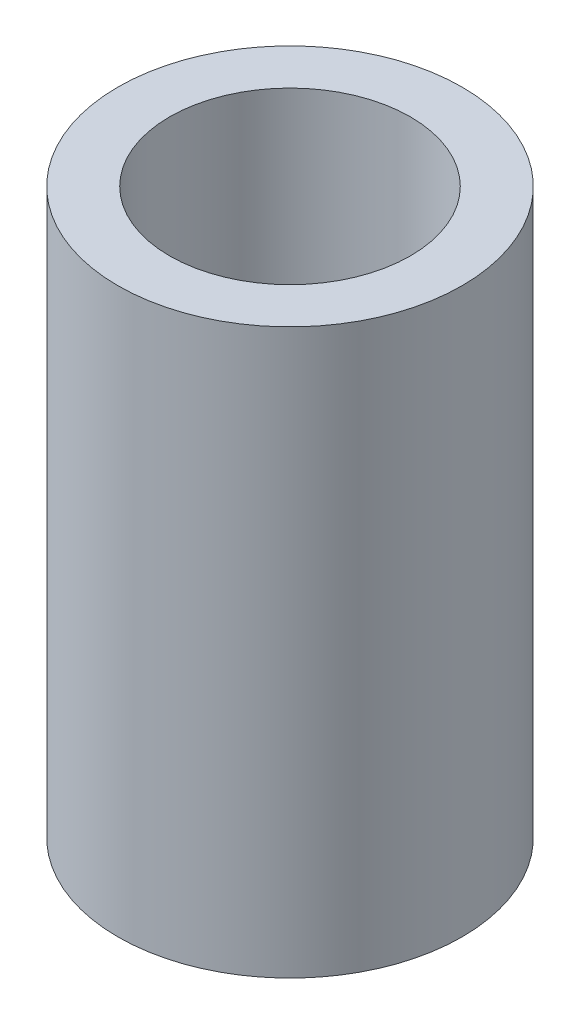
ISO-10303-21;
HEADER;
FILE_DESCRIPTION(('STEP AP214'),'2;1');
FILE_NAME('part.step','',(''),(''),'','','');
FILE_SCHEMA(('AUTOMOTIVE_DESIGN { 1 0 10303 214 1 1 1 1 }'));
ENDSEC;
DATA;
#1=APPLICATION_CONTEXT('core data for automotive mechanical design processes');
#2=APPLICATION_PROTOCOL_DEFINITION('international standard','automotive_design',2000,#1);
#3=PRODUCT_CONTEXT('',#1,'mechanical');
#4=PRODUCT('Part','Part','',(#3));
#5=PRODUCT_RELATED_PRODUCT_CATEGORY('part','',(#4));
#6=PRODUCT_DEFINITION_FORMATION('','',#4);
#7=PRODUCT_DEFINITION_CONTEXT('part definition',#1,'design');
#8=PRODUCT_DEFINITION('design','',#6,#7);
#9=PRODUCT_DEFINITION_SHAPE('','',#8);
#10=(LENGTH_UNIT() NAMED_UNIT(*) SI_UNIT(.MILLI.,.METRE.));
#11=(NAMED_UNIT(*) PLANE_ANGLE_UNIT() SI_UNIT($,.RADIAN.));
#12=(NAMED_UNIT(*) SI_UNIT($,.STERADIAN.) SOLID_ANGLE_UNIT());
#13=UNCERTAINTY_MEASURE_WITH_UNIT(LENGTH_MEASURE(1.E-05),#10,'distance_accuracy_value','');
#14=(GEOMETRIC_REPRESENTATION_CONTEXT(3) GLOBAL_UNCERTAINTY_ASSIGNED_CONTEXT((#13)) GLOBAL_UNIT_ASSIGNED_CONTEXT((#10,
#11,#12)) REPRESENTATION_CONTEXT('',''));
#15=CARTESIAN_POINT('',(0.,0.,0.));
#16=DIRECTION('',(0.,0.,1.));
#17=DIRECTION('',(1.,0.,0.));
#18=AXIS2_PLACEMENT_3D('',#15,#16,#17);
#19=CARTESIAN_POINT('',(0.,-9.36625,0.));
#20=DIRECTION('',(0.,1.,0.));
#21=DIRECTION('',(0.,0.,1.));
#22=AXIS2_PLACEMENT_3D('',#19,#20,#21);
#23=CYLINDRICAL_SURFACE('',#22,2.8575);
#24=CARTESIAN_POINT('',(0.,-9.36625,0.));
#25=DIRECTION('',(0.,1.,0.));
#26=DIRECTION('',(0.,0.,1.));
#27=AXIS2_PLACEMENT_3D('',#24,#25,#26);
#28=CIRCLE('',#27,2.8575);
#29=CARTESIAN_POINT('',(0.,-9.36625,2.8575));
#30=VERTEX_POINT('',#29);
#31=EDGE_CURVE('E10',#30,#30,#28,.T.);
#32=ORIENTED_EDGE('',*,*,#31,.T.);
#33=EDGE_LOOP('',(#32));
#34=FACE_BOUND('',#33,.T.);
#35=CARTESIAN_POINT('',(0.,0.,0.));
#36=DIRECTION('',(0.,1.,0.));
#37=DIRECTION('',(0.,0.,1.));
#38=AXIS2_PLACEMENT_3D('',#35,#36,#37);
#39=CIRCLE('',#38,2.8575);
#40=CARTESIAN_POINT('',(0.,0.,2.8575));
#41=VERTEX_POINT('',#40);
#42=EDGE_CURVE('E40',#41,#41,#39,.T.);
#43=ORIENTED_EDGE('',*,*,#42,.F.);
#44=EDGE_LOOP('',(#43));
#45=FACE_BOUND('',#44,.T.);
#46=ADVANCED_FACE('F37',(#34,#45),#23,.T.);
#47=CARTESIAN_POINT('',(0.,-9.36625,0.));
#48=DIRECTION('',(0.,1.,0.));
#49=DIRECTION('',(0.,0.,1.));
#50=AXIS2_PLACEMENT_3D('',#47,#48,#49);
#51=PLANE('',#50);
#52=CARTESIAN_POINT('',(0.,-9.36625,0.));
#53=DIRECTION('',(0.,1.,0.));
#54=DIRECTION('',(0.,0.,1.));
#55=AXIS2_PLACEMENT_3D('',#52,#53,#54);
#56=CIRCLE('',#55,2.);
#57=CARTESIAN_POINT('',(0.,-9.36625,2.));
#58=VERTEX_POINT('',#57);
#59=EDGE_CURVE('E49',#58,#58,#56,.T.);
#60=ORIENTED_EDGE('',*,*,#59,.T.);
#61=EDGE_LOOP('',(#60));
#62=FACE_BOUND('',#61,.T.);
#63=ORIENTED_EDGE('',*,*,#31,.F.);
#64=EDGE_LOOP('',(#63));
#65=FACE_BOUND('',#64,.T.);
#66=ADVANCED_FACE('F59',(#62,#65),#51,.F.);
#67=CARTESIAN_POINT('',(0.,0.,0.));
#68=DIRECTION('',(0.,1.,0.));
#69=DIRECTION('',(0.,0.,1.));
#70=AXIS2_PLACEMENT_3D('',#67,#68,#69);
#71=PLANE('',#70);
#72=CARTESIAN_POINT('',(0.,0.,0.));
#73=DIRECTION('',(0.,1.,0.));
#74=DIRECTION('',(0.,0.,1.));
#75=AXIS2_PLACEMENT_3D('',#72,#73,#74);
#76=CIRCLE('',#75,2.);
#77=CARTESIAN_POINT('',(0.,0.,2.));
#78=VERTEX_POINT('',#77);
#79=EDGE_CURVE('E51',#78,#78,#76,.T.);
#80=ORIENTED_EDGE('',*,*,#79,.F.);
#81=EDGE_LOOP('',(#80));
#82=FACE_BOUND('',#81,.T.);
#83=ORIENTED_EDGE('',*,*,#42,.T.);
#84=EDGE_LOOP('',(#83));
#85=FACE_BOUND('',#84,.T.);
#86=ADVANCED_FACE('F65',(#82,#85),#71,.T.);
#87=CARTESIAN_POINT('',(0.,-9.36625,0.));
#88=DIRECTION('',(0.,1.,0.));
#89=DIRECTION('',(0.,0.,1.));
#90=AXIS2_PLACEMENT_3D('',#87,#88,#89);
#91=CYLINDRICAL_SURFACE('',#90,2.);
#92=ORIENTED_EDGE('',*,*,#59,.F.);
#93=EDGE_LOOP('',(#92));
#94=FACE_BOUND('',#93,.T.);
#95=ORIENTED_EDGE('',*,*,#79,.T.);
#96=EDGE_LOOP('',(#95));
#97=FACE_BOUND('',#96,.T.);
#98=ADVANCED_FACE('F62',(#94,#97),#91,.F.);
#99=CLOSED_SHELL('',(#46,#66,#86,#98));
#100=MANIFOLD_SOLID_BREP('B2',#99);
#101=ADVANCED_BREP_SHAPE_REPRESENTATION('',(#18,#100),#14);
#102=SHAPE_DEFINITION_REPRESENTATION(#9,#101);
ENDSEC;
END-ISO-10303-21;
